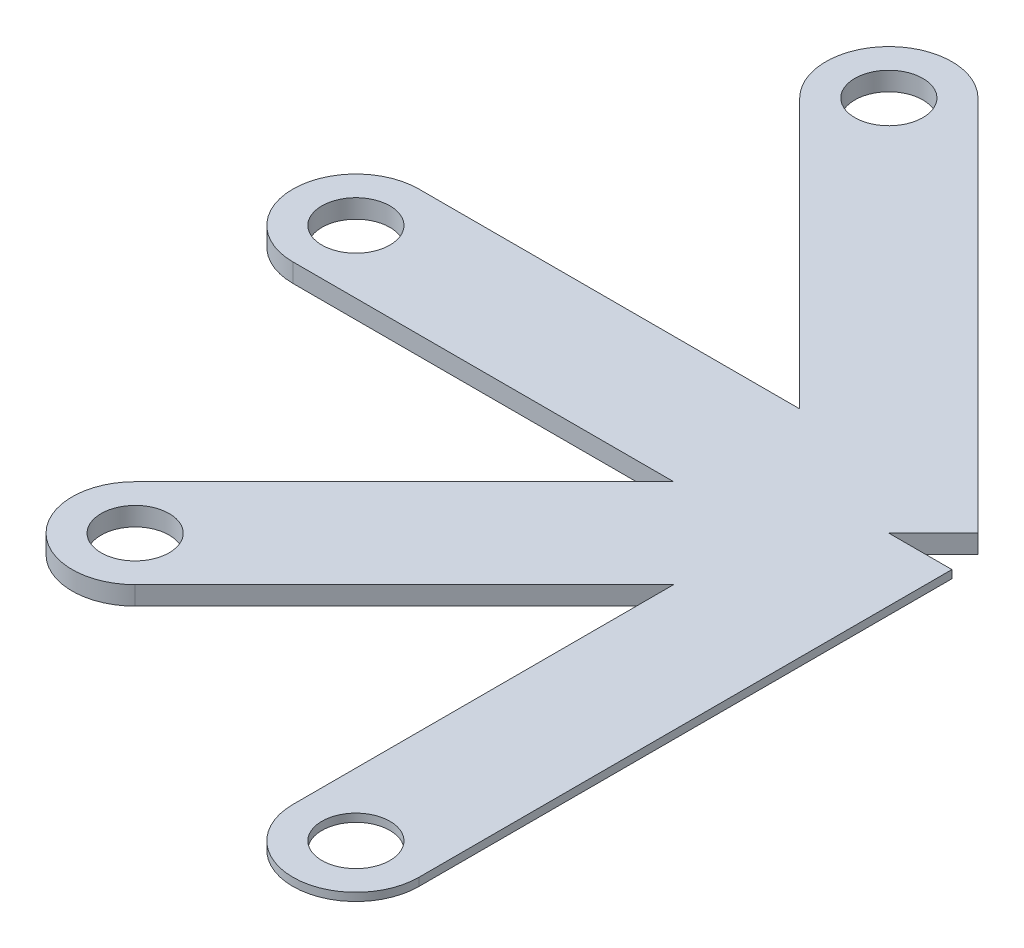
ISO-10303-21;
HEADER;
FILE_DESCRIPTION(('STEP AP214'),'2;1');
FILE_NAME('part.step','',(''),(''),'','','');
FILE_SCHEMA(('AUTOMOTIVE_DESIGN { 1 0 10303 214 1 1 1 1 }'));
ENDSEC;
DATA;
#1=APPLICATION_CONTEXT('core data for automotive mechanical design processes');
#2=APPLICATION_PROTOCOL_DEFINITION('international standard','automotive_design',2000,#1);
#3=PRODUCT_CONTEXT('',#1,'mechanical');
#4=PRODUCT('Part','Part','',(#3));
#5=PRODUCT_RELATED_PRODUCT_CATEGORY('part','',(#4));
#6=PRODUCT_DEFINITION_FORMATION('','',#4);
#7=PRODUCT_DEFINITION_CONTEXT('part definition',#1,'design');
#8=PRODUCT_DEFINITION('design','',#6,#7);
#9=PRODUCT_DEFINITION_SHAPE('','',#8);
#10=(LENGTH_UNIT() NAMED_UNIT(*) SI_UNIT(.MILLI.,.METRE.));
#11=(NAMED_UNIT(*) PLANE_ANGLE_UNIT() SI_UNIT($,.RADIAN.));
#12=(NAMED_UNIT(*) SI_UNIT($,.STERADIAN.) SOLID_ANGLE_UNIT());
#13=UNCERTAINTY_MEASURE_WITH_UNIT(LENGTH_MEASURE(1.E-05),#10,'distance_accuracy_value','');
#14=(GEOMETRIC_REPRESENTATION_CONTEXT(3) GLOBAL_UNCERTAINTY_ASSIGNED_CONTEXT((#13)) GLOBAL_UNIT_ASSIGNED_CONTEXT((#10,
#11,#12)) REPRESENTATION_CONTEXT('',''));
#15=CARTESIAN_POINT('',(0.,0.,0.));
#16=DIRECTION('',(0.,0.,1.));
#17=DIRECTION('',(1.,0.,0.));
#18=AXIS2_PLACEMENT_3D('',#15,#16,#17);
#19=CARTESIAN_POINT('',(1.69726840688207,-0.7112,1.69726840688207));
#20=DIRECTION('',(0.707106781186548,0.,-0.707106781186547));
#21=DIRECTION('',(-0.707106781186547,0.,-0.707106781186548));
#22=AXIS2_PLACEMENT_3D('',#19,#20,#21);
#23=PLANE('',#22);
#24=DIRECTION('',(0.,1.,0.));
#25=VECTOR('',#24,1.);
#26=CARTESIAN_POINT('',(1.69726840688207,-0.7112,1.69726840688207));
#27=LINE('',#26,#25);
#28=CARTESIAN_POINT('',(1.69726840688207,-0.3048,1.69726840688207));
#29=VERTEX_POINT('',#28);
#30=CARTESIAN_POINT('',(1.69726840688207,-0.7112,1.69726840688207));
#31=VERTEX_POINT('',#30);
#32=EDGE_CURVE('E202',#29,#31,#27,.F.);
#33=ORIENTED_EDGE('',*,*,#32,.T.);
#34=DIRECTION('',(-0.707106781186546,0.,-0.707106781186549));
#35=VECTOR('',#34,1.);
#36=CARTESIAN_POINT('',(1.69726840688207,-0.7112,1.69726840688207));
#37=LINE('',#36,#35);
#38=CARTESIAN_POINT('',(0.,-0.7112,0.));
#39=VERTEX_POINT('',#38);
#40=EDGE_CURVE('E177',#31,#39,#37,.T.);
#41=ORIENTED_EDGE('',*,*,#40,.T.);
#42=DIRECTION('',(0.,1.,0.));
#43=VECTOR('',#42,1.);
#44=CARTESIAN_POINT('',(0.,-0.7112,0.));
#45=LINE('',#44,#43);
#46=CARTESIAN_POINT('',(0.,-0.3048,0.));
#47=VERTEX_POINT('',#46);
#48=EDGE_CURVE('E117',#39,#47,#45,.T.);
#49=ORIENTED_EDGE('',*,*,#48,.T.);
#50=DIRECTION('',(0.707106781186547,0.,0.707106781186548));
#51=VECTOR('',#50,1.);
#52=CARTESIAN_POINT('',(0.,-0.3048,0.));
#53=LINE('',#52,#51);
#54=EDGE_CURVE('E192',#47,#29,#53,.T.);
#55=ORIENTED_EDGE('',*,*,#54,.T.);
#56=EDGE_LOOP('',(#33,#41,#49,#55));
#57=FACE_BOUND('',#56,.T.);
#58=ADVANCED_FACE('F16',(#57),#23,.T.);
#59=CARTESIAN_POINT('',(0.,-0.3048,20.2946));
#60=DIRECTION('',(0.,1.,0.));
#61=DIRECTION('',(0.,0.,1.));
#62=AXIS2_PLACEMENT_3D('',#59,#60,#61);
#63=PLANE('',#62);
#64=DIRECTION('',(0.707106781186547,0.,-0.707106781186548));
#65=VECTOR('',#64,1.);
#66=CARTESIAN_POINT('',(-12.6531808745864,-0.3048,16.0477176883506));
#67=LINE('',#66,#65);
#68=CARTESIAN_POINT('',(-2.4003,-0.3048,5.79483681376415));
#69=VERTEX_POINT('',#68);
#70=EDGE_CURVE('E215',#29,#69,#67,.F.);
#71=ORIENTED_EDGE('',*,*,#70,.F.);
#72=ORIENTED_EDGE('',*,*,#54,.F.);
#73=DIRECTION('',(-1.,0.,0.));
#74=VECTOR('',#73,1.);
#75=CARTESIAN_POINT('',(2.4003,-0.3048,0.));
#76=LINE('',#75,#74);
#77=CARTESIAN_POINT('',(2.4003,-0.3048,0.));
#78=VERTEX_POINT('',#77);
#79=EDGE_CURVE('E195',#78,#47,#76,.T.);
#80=ORIENTED_EDGE('',*,*,#79,.F.);
#81=DIRECTION('',(0.,0.,-1.));
#82=VECTOR('',#81,1.);
#83=CARTESIAN_POINT('',(2.4003,-0.3048,20.2946));
#84=LINE('',#83,#82);
#85=CARTESIAN_POINT('',(2.4003,-0.3048,20.2946));
#86=VERTEX_POINT('',#85);
#87=EDGE_CURVE('E125',#86,#78,#84,.T.);
#88=ORIENTED_EDGE('',*,*,#87,.F.);
#89=CARTESIAN_POINT('',(0.,-0.3048,20.2946));
#90=DIRECTION('',(0.,-1.,0.));
#91=DIRECTION('',(0.,0.,-1.));
#92=AXIS2_PLACEMENT_3D('',#89,#90,#91);
#93=CIRCLE('',#92,2.4003);
#94=CARTESIAN_POINT('',(-2.4003,-0.3048,20.2946));
#95=VERTEX_POINT('',#94);
#96=EDGE_CURVE('E281',#95,#86,#93,.F.);
#97=ORIENTED_EDGE('',*,*,#96,.F.);
#98=DIRECTION('',(0.,0.,1.));
#99=VECTOR('',#98,1.);
#100=CARTESIAN_POINT('',(-2.4003,-0.3048,0.));
#101=LINE('',#100,#99);
#102=EDGE_CURVE('E209',#69,#95,#101,.T.);
#103=ORIENTED_EDGE('',*,*,#102,.F.);
#104=EDGE_LOOP('',(#71,#72,#80,#88,#97,#103));
#105=FACE_BOUND('',#104,.T.);
#106=CARTESIAN_POINT('',(0.,-0.3048,20.2946));
#107=DIRECTION('',(0.,-1.,0.));
#108=DIRECTION('',(0.,0.,-1.));
#109=AXIS2_PLACEMENT_3D('',#106,#107,#108);
#110=CIRCLE('',#109,1.2954);
#111=CARTESIAN_POINT('',(0.,-0.3048,18.9992));
#112=VERTEX_POINT('',#111);
#113=EDGE_CURVE('E274',#112,#112,#110,.F.);
#114=ORIENTED_EDGE('',*,*,#113,.T.);
#115=EDGE_LOOP('',(#114));
#116=FACE_BOUND('',#115,.T.);
#117=ADVANCED_FACE('F552',(#105,#116),#63,.F.);
#118=CARTESIAN_POINT('',(-14.3504492814685,-0.7112,14.3504492814685));
#119=DIRECTION('',(0.,1.,0.));
#120=DIRECTION('',(0.,0.,1.));
#121=AXIS2_PLACEMENT_3D('',#118,#119,#120);
#122=PLANE('',#121);
#123=CARTESIAN_POINT('',(-14.3504492814685,-0.7112,-14.3504492814685));
#124=DIRECTION('',(0.,-1.,0.));
#125=DIRECTION('',(0.,0.,-1.));
#126=AXIS2_PLACEMENT_3D('',#123,#124,#125);
#127=CIRCLE('',#126,1.2954);
#128=CARTESIAN_POINT('',(-14.3504492814685,-0.7112,-15.6458492814685));
#129=VERTEX_POINT('',#128);
#130=EDGE_CURVE('E264',#129,#129,#127,.F.);
#131=ORIENTED_EDGE('',*,*,#130,.T.);
#132=EDGE_LOOP('',(#131));
#133=FACE_BOUND('',#132,.T.);
#134=CARTESIAN_POINT('',(-20.2946,-0.7112,0.));
#135=DIRECTION('',(0.,-1.,0.));
#136=DIRECTION('',(0.,0.,-1.));
#137=AXIS2_PLACEMENT_3D('',#134,#135,#136);
#138=CIRCLE('',#137,1.2954);
#139=CARTESIAN_POINT('',(-20.2946,-0.7112,-1.2954));
#140=VERTEX_POINT('',#139);
#141=EDGE_CURVE('E268',#140,#140,#138,.F.);
#142=ORIENTED_EDGE('',*,*,#141,.T.);
#143=EDGE_LOOP('',(#142));
#144=FACE_BOUND('',#143,.T.);
#145=CARTESIAN_POINT('',(-14.3504492814685,-0.7112,14.3504492814685));
#146=DIRECTION('',(0.,-1.,0.));
#147=DIRECTION('',(0.,0.,-1.));
#148=AXIS2_PLACEMENT_3D('',#145,#146,#147);
#149=CIRCLE('',#148,1.2954);
#150=CARTESIAN_POINT('',(-14.3504492814685,-0.7112,13.0550492814685));
#151=VERTEX_POINT('',#150);
#152=EDGE_CURVE('E271',#151,#151,#149,.F.);
#153=ORIENTED_EDGE('',*,*,#152,.T.);
#154=EDGE_LOOP('',(#153));
#155=FACE_BOUND('',#154,.T.);
#156=DIRECTION('',(0.707106781186548,0.,0.707106781186547));
#157=VECTOR('',#156,1.);
#158=CARTESIAN_POINT('',(-16.0477176883506,-0.7112,-12.6531808745864));
#159=LINE('',#158,#157);
#160=CARTESIAN_POINT('',(-16.0477176883506,-0.7112,-12.6531808745864));
#161=VERTEX_POINT('',#160);
#162=CARTESIAN_POINT('',(-5.79483681376415,-0.7112,-2.4003));
#163=VERTEX_POINT('',#162);
#164=EDGE_CURVE('E104',#161,#163,#159,.T.);
#165=ORIENTED_EDGE('',*,*,#164,.F.);
#166=CARTESIAN_POINT('',(-14.3504492814685,-0.7112,-14.3504492814685));
#167=DIRECTION('',(0.,-1.,0.));
#168=DIRECTION('',(0.,0.,-1.));
#169=AXIS2_PLACEMENT_3D('',#166,#167,#168);
#170=CIRCLE('',#169,2.4003);
#171=CARTESIAN_POINT('',(-12.6531808745865,-0.7112,-16.0477176883506));
#172=VERTEX_POINT('',#171);
#173=EDGE_CURVE('E278',#172,#161,#170,.F.);
#174=ORIENTED_EDGE('',*,*,#173,.F.);
#175=DIRECTION('',(-0.707106781186548,0.,-0.707106781186547));
#176=VECTOR('',#175,1.);
#177=CARTESIAN_POINT('',(1.69726840688207,-0.7112,-1.69726840688207));
#178=LINE('',#177,#176);
#179=CARTESIAN_POINT('',(1.69726840688207,-0.7112,-1.69726840688207));
#180=VERTEX_POINT('',#179);
#181=EDGE_CURVE('E180',#180,#172,#178,.T.);
#182=ORIENTED_EDGE('',*,*,#181,.F.);
#183=DIRECTION('',(0.707106781186548,0.,-0.707106781186547));
#184=VECTOR('',#183,1.);
#185=CARTESIAN_POINT('',(-1.69726840688207,-0.7112,1.69726840688207));
#186=LINE('',#185,#184);
#187=EDGE_CURVE('E185',#39,#180,#186,.T.);
#188=ORIENTED_EDGE('',*,*,#187,.F.);
#189=ORIENTED_EDGE('',*,*,#40,.F.);
#190=DIRECTION('',(0.707106781186547,0.,-0.707106781186548));
#191=VECTOR('',#190,1.);
#192=CARTESIAN_POINT('',(-12.6531808745864,-0.7112,16.0477176883506));
#193=LINE('',#192,#191);
#194=CARTESIAN_POINT('',(-12.6531808745864,-0.7112,16.0477176883506));
#195=VERTEX_POINT('',#194);
#196=EDGE_CURVE('E220',#195,#31,#193,.T.);
#197=ORIENTED_EDGE('',*,*,#196,.F.);
#198=CARTESIAN_POINT('',(-14.3504492814685,-0.7112,14.3504492814685));
#199=DIRECTION('',(0.,-1.,0.));
#200=DIRECTION('',(0.,0.,-1.));
#201=AXIS2_PLACEMENT_3D('',#198,#199,#200);
#202=CIRCLE('',#201,2.4003);
#203=CARTESIAN_POINT('',(-16.0477176883506,-0.7112,12.6531808745864));
#204=VERTEX_POINT('',#203);
#205=EDGE_CURVE('E153',#204,#195,#202,.F.);
#206=ORIENTED_EDGE('',*,*,#205,.F.);
#207=DIRECTION('',(-0.707106781186547,0.,0.707106781186548));
#208=VECTOR('',#207,1.);
#209=CARTESIAN_POINT('',(-1.69726840688207,-0.7112,-1.69726840688207));
#210=LINE('',#209,#208);
#211=CARTESIAN_POINT('',(-5.79483681376414,-0.7112,2.40030000000001));
#212=VERTEX_POINT('',#211);
#213=EDGE_CURVE('E150',#212,#204,#210,.T.);
#214=ORIENTED_EDGE('',*,*,#213,.F.);
#215=DIRECTION('',(1.,0.,0.));
#216=VECTOR('',#215,1.);
#217=CARTESIAN_POINT('',(-20.2946,-0.7112,2.4003));
#218=LINE('',#217,#216);
#219=CARTESIAN_POINT('',(-20.2946,-0.7112,2.4003));
#220=VERTEX_POINT('',#219);
#221=EDGE_CURVE('E138',#220,#212,#218,.T.);
#222=ORIENTED_EDGE('',*,*,#221,.F.);
#223=CARTESIAN_POINT('',(-20.2946,-0.7112,0.));
#224=DIRECTION('',(0.,-1.,0.));
#225=DIRECTION('',(0.,0.,-1.));
#226=AXIS2_PLACEMENT_3D('',#223,#224,#225);
#227=CIRCLE('',#226,2.4003);
#228=CARTESIAN_POINT('',(-20.2946,-0.7112,-2.4003));
#229=VERTEX_POINT('',#228);
#230=EDGE_CURVE('E19',#229,#220,#227,.F.);
#231=ORIENTED_EDGE('',*,*,#230,.F.);
#232=DIRECTION('',(-1.,0.,0.));
#233=VECTOR('',#232,1.);
#234=CARTESIAN_POINT('',(0.,-0.7112,-2.4003));
#235=LINE('',#234,#233);
#236=EDGE_CURVE('E96',#163,#229,#235,.T.);
#237=ORIENTED_EDGE('',*,*,#236,.F.);
#238=EDGE_LOOP('',(#165,#174,#182,#188,#189,#197,#206,#214,#222,#231,#237));
#239=FACE_BOUND('',#238,.T.);
#240=ADVANCED_FACE('F151',(#133,#144,#155,#239),#122,.F.);
#241=CARTESIAN_POINT('',(-16.0477176883506,-0.7112,-12.6531808745864));
#242=DIRECTION('',(-0.707106781186547,0.,0.707106781186548));
#243=DIRECTION('',(0.707106781186548,0.,0.707106781186547));
#244=AXIS2_PLACEMENT_3D('',#241,#242,#243);
#245=PLANE('',#244);
#246=DIRECTION('',(0.707106781186548,0.,0.707106781186547));
#247=VECTOR('',#246,1.);
#248=CARTESIAN_POINT('',(-16.0477176883506,0.,-12.6531808745864));
#249=LINE('',#248,#247);
#250=CARTESIAN_POINT('',(-16.0477176883506,0.,-12.6531808745864));
#251=VERTEX_POINT('',#250);
#252=CARTESIAN_POINT('',(-5.79483681376415,0.,-2.4003));
#253=VERTEX_POINT('',#252);
#254=EDGE_CURVE('E267',#251,#253,#249,.T.);
#255=ORIENTED_EDGE('',*,*,#254,.F.);
#256=DIRECTION('',(0.,-1.,0.));
#257=VECTOR('',#256,1.);
#258=CARTESIAN_POINT('',(-16.0477176883506,-0.7112,-12.6531808745864));
#259=LINE('',#258,#257);
#260=EDGE_CURVE('E277',#161,#251,#259,.F.);
#261=ORIENTED_EDGE('',*,*,#260,.F.);
#262=ORIENTED_EDGE('',*,*,#164,.T.);
#263=DIRECTION('',(0.,1.,0.));
#264=VECTOR('',#263,1.);
#265=CARTESIAN_POINT('',(-5.79483681376415,-0.7112,-2.4003));
#266=LINE('',#265,#264);
#267=EDGE_CURVE('E172',#253,#163,#266,.F.);
#268=ORIENTED_EDGE('',*,*,#267,.F.);
#269=EDGE_LOOP('',(#255,#261,#262,#268));
#270=FACE_BOUND('',#269,.T.);
#271=ADVANCED_FACE('F365',(#270),#245,.T.);
#272=CARTESIAN_POINT('',(0.,-0.7112,-2.4003));
#273=DIRECTION('',(0.,0.,-1.));
#274=DIRECTION('',(-1.,0.,0.));
#275=AXIS2_PLACEMENT_3D('',#272,#273,#274);
#276=PLANE('',#275);
#277=DIRECTION('',(0.,-1.,0.));
#278=VECTOR('',#277,1.);
#279=CARTESIAN_POINT('',(-20.2946,-0.7112,-2.4003));
#280=LINE('',#279,#278);
#281=CARTESIAN_POINT('',(-20.2946,0.,-2.4003));
#282=VERTEX_POINT('',#281);
#283=EDGE_CURVE('E169',#282,#229,#280,.T.);
#284=ORIENTED_EDGE('',*,*,#283,.F.);
#285=DIRECTION('',(1.,0.,0.));
#286=VECTOR('',#285,1.);
#287=CARTESIAN_POINT('',(0.,0.,-2.4003));
#288=LINE('',#287,#286);
#289=EDGE_CURVE('E263',#253,#282,#288,.F.);
#290=ORIENTED_EDGE('',*,*,#289,.F.);
#291=ORIENTED_EDGE('',*,*,#267,.T.);
#292=ORIENTED_EDGE('',*,*,#236,.T.);
#293=EDGE_LOOP('',(#284,#290,#291,#292));
#294=FACE_BOUND('',#293,.T.);
#295=ADVANCED_FACE('F368',(#294),#276,.T.);
#296=CARTESIAN_POINT('',(-20.2946,-0.7112,0.));
#297=DIRECTION('',(0.,-1.,0.));
#298=DIRECTION('',(0.,0.,-1.));
#299=AXIS2_PLACEMENT_3D('',#296,#297,#298);
#300=CYLINDRICAL_SURFACE('',#299,2.4003);
#301=ORIENTED_EDGE('',*,*,#230,.T.);
#302=DIRECTION('',(0.,1.,0.));
#303=VECTOR('',#302,1.);
#304=CARTESIAN_POINT('',(-20.2946,-0.7112,2.4003));
#305=LINE('',#304,#303);
#306=CARTESIAN_POINT('',(-20.2946,0.,2.4003));
#307=VERTEX_POINT('',#306);
#308=EDGE_CURVE('E145',#307,#220,#305,.F.);
#309=ORIENTED_EDGE('',*,*,#308,.F.);
#310=CARTESIAN_POINT('',(-20.2946,0.,0.));
#311=DIRECTION('',(0.,-1.,0.));
#312=DIRECTION('',(0.,0.,-1.));
#313=AXIS2_PLACEMENT_3D('',#310,#311,#312);
#314=CIRCLE('',#313,2.4003);
#315=EDGE_CURVE('E259',#282,#307,#314,.F.);
#316=ORIENTED_EDGE('',*,*,#315,.F.);
#317=ORIENTED_EDGE('',*,*,#283,.T.);
#318=EDGE_LOOP('',(#301,#309,#316,#317));
#319=FACE_BOUND('',#318,.T.);
#320=ADVANCED_FACE('F370',(#319),#300,.T.);
#321=CARTESIAN_POINT('',(-20.2946,-0.7112,2.4003));
#322=DIRECTION('',(0.,0.,1.));
#323=DIRECTION('',(1.,0.,0.));
#324=AXIS2_PLACEMENT_3D('',#321,#322,#323);
#325=PLANE('',#324);
#326=DIRECTION('',(1.,0.,0.));
#327=VECTOR('',#326,1.);
#328=CARTESIAN_POINT('',(0.,0.,2.4003));
#329=LINE('',#328,#327);
#330=CARTESIAN_POINT('',(-5.79483681376415,0.,2.4003));
#331=VERTEX_POINT('',#330);
#332=EDGE_CURVE('E262',#307,#331,#329,.T.);
#333=ORIENTED_EDGE('',*,*,#332,.F.);
#334=ORIENTED_EDGE('',*,*,#308,.T.);
#335=ORIENTED_EDGE('',*,*,#221,.T.);
#336=DIRECTION('',(0.,1.,0.));
#337=VECTOR('',#336,1.);
#338=CARTESIAN_POINT('',(-5.79483681376414,-0.7112,2.40030000000001));
#339=LINE('',#338,#337);
#340=EDGE_CURVE('E143',#331,#212,#339,.F.);
#341=ORIENTED_EDGE('',*,*,#340,.F.);
#342=EDGE_LOOP('',(#333,#334,#335,#341));
#343=FACE_BOUND('',#342,.T.);
#344=ADVANCED_FACE('F141',(#343),#325,.T.);
#345=CARTESIAN_POINT('',(-1.69726840688207,-0.7112,-1.69726840688207));
#346=DIRECTION('',(-0.707106781186548,0.,-0.707106781186547));
#347=DIRECTION('',(-0.707106781186547,0.,0.707106781186548));
#348=AXIS2_PLACEMENT_3D('',#345,#346,#347);
#349=PLANE('',#348);
#350=DIRECTION('',(0.,-1.,0.));
#351=VECTOR('',#350,1.);
#352=CARTESIAN_POINT('',(-16.0477176883506,-0.7112,12.6531808745864));
#353=LINE('',#352,#351);
#354=CARTESIAN_POINT('',(-16.0477176883506,0.,12.6531808745864));
#355=VERTEX_POINT('',#354);
#356=EDGE_CURVE('E156',#355,#204,#353,.T.);
#357=ORIENTED_EDGE('',*,*,#356,.F.);
#358=DIRECTION('',(-0.707106781186547,0.,0.707106781186548));
#359=VECTOR('',#358,1.);
#360=CARTESIAN_POINT('',(-5.79483681376415,0.,2.4003));
#361=LINE('',#360,#359);
#362=EDGE_CURVE('E160',#331,#355,#361,.T.);
#363=ORIENTED_EDGE('',*,*,#362,.F.);
#364=ORIENTED_EDGE('',*,*,#340,.T.);
#365=ORIENTED_EDGE('',*,*,#213,.T.);
#366=EDGE_LOOP('',(#357,#363,#364,#365));
#367=FACE_BOUND('',#366,.T.);
#368=ADVANCED_FACE('F158',(#367),#349,.T.);
#369=CARTESIAN_POINT('',(-14.3504492814685,-0.7112,14.3504492814685));
#370=DIRECTION('',(0.,-1.,0.));
#371=DIRECTION('',(0.,0.,-1.));
#372=AXIS2_PLACEMENT_3D('',#369,#370,#371);
#373=CYLINDRICAL_SURFACE('',#372,2.4003);
#374=ORIENTED_EDGE('',*,*,#205,.T.);
#375=DIRECTION('',(0.,1.,0.));
#376=VECTOR('',#375,1.);
#377=CARTESIAN_POINT('',(-12.6531808745864,-0.7112,16.0477176883506));
#378=LINE('',#377,#376);
#379=CARTESIAN_POINT('',(-12.6531808745864,0.,16.0477176883506));
#380=VERTEX_POINT('',#379);
#381=EDGE_CURVE('E217',#380,#195,#378,.F.);
#382=ORIENTED_EDGE('',*,*,#381,.F.);
#383=CARTESIAN_POINT('',(-14.3504492814685,0.,14.3504492814685));
#384=DIRECTION('',(0.,-1.,0.));
#385=DIRECTION('',(0.,0.,-1.));
#386=AXIS2_PLACEMENT_3D('',#383,#384,#385);
#387=CIRCLE('',#386,2.4003);
#388=EDGE_CURVE('E255',#355,#380,#387,.F.);
#389=ORIENTED_EDGE('',*,*,#388,.F.);
#390=ORIENTED_EDGE('',*,*,#356,.T.);
#391=EDGE_LOOP('',(#374,#382,#389,#390));
#392=FACE_BOUND('',#391,.T.);
#393=ADVANCED_FACE('F284',(#392),#373,.T.);
#394=CARTESIAN_POINT('',(-12.6531808745864,-0.7112,16.0477176883506));
#395=DIRECTION('',(0.707106781186548,0.,0.707106781186547));
#396=DIRECTION('',(0.707106781186547,0.,-0.707106781186548));
#397=AXIS2_PLACEMENT_3D('',#394,#395,#396);
#398=PLANE('',#397);
#399=ORIENTED_EDGE('',*,*,#196,.T.);
#400=ORIENTED_EDGE('',*,*,#32,.F.);
#401=ORIENTED_EDGE('',*,*,#70,.T.);
#402=DIRECTION('',(0.,1.,0.));
#403=VECTOR('',#402,1.);
#404=CARTESIAN_POINT('',(-2.4003,-0.3048,5.79483681376415));
#405=LINE('',#404,#403);
#406=CARTESIAN_POINT('',(-2.4003,0.,5.79483681376415));
#407=VERTEX_POINT('',#406);
#408=EDGE_CURVE('E212',#407,#69,#405,.F.);
#409=ORIENTED_EDGE('',*,*,#408,.F.);
#410=DIRECTION('',(0.707106781186548,0.,-0.707106781186548));
#411=VECTOR('',#410,1.);
#412=CARTESIAN_POINT('',(-12.6531808745864,0.,16.0477176883506));
#413=LINE('',#412,#411);
#414=EDGE_CURVE('E258',#380,#407,#413,.T.);
#415=ORIENTED_EDGE('',*,*,#414,.F.);
#416=ORIENTED_EDGE('',*,*,#381,.T.);
#417=EDGE_LOOP('',(#399,#400,#401,#409,#415,#416));
#418=FACE_BOUND('',#417,.T.);
#419=ADVANCED_FACE('F341',(#418),#398,.T.);
#420=CARTESIAN_POINT('',(-2.4003,-0.3048,0.));
#421=DIRECTION('',(-1.,0.,0.));
#422=DIRECTION('',(0.,0.,1.));
#423=AXIS2_PLACEMENT_3D('',#420,#421,#422);
#424=PLANE('',#423);
#425=DIRECTION('',(0.,-1.,0.));
#426=VECTOR('',#425,1.);
#427=CARTESIAN_POINT('',(-2.4003,-0.3048,20.2946));
#428=LINE('',#427,#426);
#429=CARTESIAN_POINT('',(-2.4003,0.,20.2946));
#430=VERTEX_POINT('',#429);
#431=EDGE_CURVE('E211',#430,#95,#428,.T.);
#432=ORIENTED_EDGE('',*,*,#431,.F.);
#433=DIRECTION('',(0.,0.,1.));
#434=VECTOR('',#433,1.);
#435=CARTESIAN_POINT('',(-2.4003,0.,20.2946));
#436=LINE('',#435,#434);
#437=EDGE_CURVE('E254',#407,#430,#436,.T.);
#438=ORIENTED_EDGE('',*,*,#437,.F.);
#439=ORIENTED_EDGE('',*,*,#408,.T.);
#440=ORIENTED_EDGE('',*,*,#102,.T.);
#441=EDGE_LOOP('',(#432,#438,#439,#440));
#442=FACE_BOUND('',#441,.T.);
#443=ADVANCED_FACE('F419',(#442),#424,.T.);
#444=CARTESIAN_POINT('',(0.,-0.3048,20.2946));
#445=DIRECTION('',(0.,-1.,0.));
#446=DIRECTION('',(0.,0.,-1.));
#447=AXIS2_PLACEMENT_3D('',#444,#445,#446);
#448=CYLINDRICAL_SURFACE('',#447,2.4003);
#449=ORIENTED_EDGE('',*,*,#96,.T.);
#450=DIRECTION('',(0.,1.,0.));
#451=VECTOR('',#450,1.);
#452=CARTESIAN_POINT('',(2.4003,-0.3048,20.2946));
#453=LINE('',#452,#451);
#454=CARTESIAN_POINT('',(2.4003,0.,20.2946));
#455=VERTEX_POINT('',#454);
#456=EDGE_CURVE('E206',#455,#86,#453,.F.);
#457=ORIENTED_EDGE('',*,*,#456,.F.);
#458=CARTESIAN_POINT('',(0.,0.,20.2946));
#459=DIRECTION('',(0.,-1.,0.));
#460=DIRECTION('',(0.,0.,-1.));
#461=AXIS2_PLACEMENT_3D('',#458,#459,#460);
#462=CIRCLE('',#461,2.4003);
#463=EDGE_CURVE('E250',#430,#455,#462,.F.);
#464=ORIENTED_EDGE('',*,*,#463,.F.);
#465=ORIENTED_EDGE('',*,*,#431,.T.);
#466=EDGE_LOOP('',(#449,#457,#464,#465));
#467=FACE_BOUND('',#466,.T.);
#468=ADVANCED_FACE('F416',(#467),#448,.T.);
#469=CARTESIAN_POINT('',(2.4003,-0.3048,20.2946));
#470=DIRECTION('',(1.,0.,0.));
#471=DIRECTION('',(0.,0.,-1.));
#472=AXIS2_PLACEMENT_3D('',#469,#470,#471);
#473=PLANE('',#472);
#474=ORIENTED_EDGE('',*,*,#87,.T.);
#475=DIRECTION('',(0.,1.,0.));
#476=VECTOR('',#475,1.);
#477=CARTESIAN_POINT('',(2.4003,-0.3048,0.));
#478=LINE('',#477,#476);
#479=CARTESIAN_POINT('',(2.4003,0.,0.));
#480=VERTEX_POINT('',#479);
#481=EDGE_CURVE('E198',#480,#78,#478,.F.);
#482=ORIENTED_EDGE('',*,*,#481,.F.);
#483=DIRECTION('',(0.,0.,1.));
#484=VECTOR('',#483,1.);
#485=CARTESIAN_POINT('',(2.4003,0.,20.2946));
#486=LINE('',#485,#484);
#487=EDGE_CURVE('E253',#455,#480,#486,.F.);
#488=ORIENTED_EDGE('',*,*,#487,.F.);
#489=ORIENTED_EDGE('',*,*,#456,.T.);
#490=EDGE_LOOP('',(#474,#482,#488,#489));
#491=FACE_BOUND('',#490,.T.);
#492=ADVANCED_FACE('F412',(#491),#473,.T.);
#493=CARTESIAN_POINT('',(2.4003,-0.3048,0.));
#494=DIRECTION('',(0.,0.,-1.));
#495=DIRECTION('',(-1.,0.,0.));
#496=AXIS2_PLACEMENT_3D('',#493,#494,#495);
#497=PLANE('',#496);
#498=ORIENTED_EDGE('',*,*,#481,.T.);
#499=ORIENTED_EDGE('',*,*,#79,.T.);
#500=DIRECTION('',(0.,1.,0.));
#501=VECTOR('',#500,1.);
#502=CARTESIAN_POINT('',(0.,-0.7112,0.));
#503=LINE('',#502,#501);
#504=CARTESIAN_POINT('',(0.,0.,0.));
#505=VERTEX_POINT('',#504);
#506=EDGE_CURVE('E188',#505,#47,#503,.F.);
#507=ORIENTED_EDGE('',*,*,#506,.F.);
#508=DIRECTION('',(1.,0.,0.));
#509=VECTOR('',#508,1.);
#510=CARTESIAN_POINT('',(0.,0.,0.));
#511=LINE('',#510,#509);
#512=EDGE_CURVE('E319',#480,#505,#511,.F.);
#513=ORIENTED_EDGE('',*,*,#512,.F.);
#514=EDGE_LOOP('',(#498,#499,#507,#513));
#515=FACE_BOUND('',#514,.T.);
#516=ADVANCED_FACE('F409',(#515),#497,.T.);
#517=CARTESIAN_POINT('',(-1.69726840688207,-0.7112,1.69726840688207));
#518=DIRECTION('',(0.707106781186547,0.,0.707106781186548));
#519=DIRECTION('',(0.707106781186548,0.,-0.707106781186547));
#520=AXIS2_PLACEMENT_3D('',#517,#518,#519);
#521=PLANE('',#520);
#522=ORIENTED_EDGE('',*,*,#187,.T.);
#523=DIRECTION('',(0.,1.,0.));
#524=VECTOR('',#523,1.);
#525=CARTESIAN_POINT('',(1.69726840688207,-0.7112,-1.69726840688207));
#526=LINE('',#525,#524);
#527=CARTESIAN_POINT('',(1.69726840688207,0.,-1.69726840688207));
#528=VERTEX_POINT('',#527);
#529=EDGE_CURVE('E182',#528,#180,#526,.F.);
#530=ORIENTED_EDGE('',*,*,#529,.F.);
#531=DIRECTION('',(0.707106781186548,0.,-0.707106781186547));
#532=VECTOR('',#531,1.);
#533=CARTESIAN_POINT('',(0.,0.,0.));
#534=LINE('',#533,#532);
#535=EDGE_CURVE('E316',#505,#528,#534,.T.);
#536=ORIENTED_EDGE('',*,*,#535,.F.);
#537=ORIENTED_EDGE('',*,*,#506,.T.);
#538=ORIENTED_EDGE('',*,*,#48,.F.);
#539=EDGE_LOOP('',(#522,#530,#536,#537,#538));
#540=FACE_BOUND('',#539,.T.);
#541=ADVANCED_FACE('F360',(#540),#521,.T.);
#542=CARTESIAN_POINT('',(1.69726840688207,-0.7112,-1.69726840688207));
#543=DIRECTION('',(0.707106781186547,0.,-0.707106781186548));
#544=DIRECTION('',(-0.707106781186548,0.,-0.707106781186547));
#545=AXIS2_PLACEMENT_3D('',#542,#543,#544);
#546=PLANE('',#545);
#547=ORIENTED_EDGE('',*,*,#181,.T.);
#548=DIRECTION('',(0.,-1.,0.));
#549=VECTOR('',#548,1.);
#550=CARTESIAN_POINT('',(-12.6531808745865,-0.7112,-16.0477176883506));
#551=LINE('',#550,#549);
#552=CARTESIAN_POINT('',(-12.6531808745864,0.,-16.0477176883506));
#553=VERTEX_POINT('',#552);
#554=EDGE_CURVE('E34',#553,#172,#551,.T.);
#555=ORIENTED_EDGE('',*,*,#554,.F.);
#556=DIRECTION('',(-0.707106781186548,0.,-0.707106781186547));
#557=VECTOR('',#556,1.);
#558=CARTESIAN_POINT('',(1.69726840688207,0.,-1.69726840688207));
#559=LINE('',#558,#557);
#560=EDGE_CURVE('E249',#528,#553,#559,.T.);
#561=ORIENTED_EDGE('',*,*,#560,.F.);
#562=ORIENTED_EDGE('',*,*,#529,.T.);
#563=EDGE_LOOP('',(#547,#555,#561,#562));
#564=FACE_BOUND('',#563,.T.);
#565=ADVANCED_FACE('F355',(#564),#546,.T.);
#566=CARTESIAN_POINT('',(-14.3504492814685,-0.7112,-14.3504492814685));
#567=DIRECTION('',(0.,-1.,0.));
#568=DIRECTION('',(0.,0.,-1.));
#569=AXIS2_PLACEMENT_3D('',#566,#567,#568);
#570=CYLINDRICAL_SURFACE('',#569,2.4003);
#571=ORIENTED_EDGE('',*,*,#173,.T.);
#572=ORIENTED_EDGE('',*,*,#260,.T.);
#573=CARTESIAN_POINT('',(-14.3504492814685,0.,-14.3504492814685));
#574=DIRECTION('',(0.,-1.,0.));
#575=DIRECTION('',(0.,0.,-1.));
#576=AXIS2_PLACEMENT_3D('',#573,#574,#575);
#577=CIRCLE('',#576,2.4003);
#578=EDGE_CURVE('E246',#553,#251,#577,.F.);
#579=ORIENTED_EDGE('',*,*,#578,.F.);
#580=ORIENTED_EDGE('',*,*,#554,.T.);
#581=EDGE_LOOP('',(#571,#572,#579,#580));
#582=FACE_BOUND('',#581,.T.);
#583=ADVANCED_FACE('F364',(#582),#570,.T.);
#584=CARTESIAN_POINT('',(0.,-0.3048,20.2946));
#585=DIRECTION('',(0.,-1.,0.));
#586=DIRECTION('',(0.,0.,-1.));
#587=AXIS2_PLACEMENT_3D('',#584,#585,#586);
#588=CYLINDRICAL_SURFACE('',#587,1.2954);
#589=CARTESIAN_POINT('',(0.,0.,20.2946));
#590=DIRECTION('',(0.,-1.,0.));
#591=DIRECTION('',(0.,0.,-1.));
#592=AXIS2_PLACEMENT_3D('',#589,#590,#591);
#593=CIRCLE('',#592,1.2954);
#594=CARTESIAN_POINT('',(0.,0.,18.9992));
#595=VERTEX_POINT('',#594);
#596=EDGE_CURVE('E243',#595,#595,#593,.T.);
#597=ORIENTED_EDGE('',*,*,#596,.F.);
#598=EDGE_LOOP('',(#597));
#599=FACE_BOUND('',#598,.T.);
#600=ORIENTED_EDGE('',*,*,#113,.F.);
#601=EDGE_LOOP('',(#600));
#602=FACE_BOUND('',#601,.T.);
#603=ADVANCED_FACE('F398',(#599,#602),#588,.F.);
#604=CARTESIAN_POINT('',(-14.3504492814685,-0.7112,14.3504492814685));
#605=DIRECTION('',(0.,-1.,0.));
#606=DIRECTION('',(0.,0.,-1.));
#607=AXIS2_PLACEMENT_3D('',#604,#605,#606);
#608=CYLINDRICAL_SURFACE('',#607,1.2954);
#609=CARTESIAN_POINT('',(-14.3504492814685,0.,14.3504492814685));
#610=DIRECTION('',(0.,-1.,0.));
#611=DIRECTION('',(0.,0.,-1.));
#612=AXIS2_PLACEMENT_3D('',#609,#610,#611);
#613=CIRCLE('',#612,1.2954);
#614=CARTESIAN_POINT('',(-14.3504492814685,0.,13.0550492814685));
#615=VERTEX_POINT('',#614);
#616=EDGE_CURVE('E240',#615,#615,#613,.T.);
#617=ORIENTED_EDGE('',*,*,#616,.F.);
#618=EDGE_LOOP('',(#617));
#619=FACE_BOUND('',#618,.T.);
#620=ORIENTED_EDGE('',*,*,#152,.F.);
#621=EDGE_LOOP('',(#620));
#622=FACE_BOUND('',#621,.T.);
#623=ADVANCED_FACE('F394',(#619,#622),#608,.F.);
#624=CARTESIAN_POINT('',(-20.2946,-0.7112,0.));
#625=DIRECTION('',(0.,-1.,0.));
#626=DIRECTION('',(0.,0.,-1.));
#627=AXIS2_PLACEMENT_3D('',#624,#625,#626);
#628=CYLINDRICAL_SURFACE('',#627,1.2954);
#629=CARTESIAN_POINT('',(-20.2946,0.,0.));
#630=DIRECTION('',(0.,-1.,0.));
#631=DIRECTION('',(0.,0.,-1.));
#632=AXIS2_PLACEMENT_3D('',#629,#630,#631);
#633=CIRCLE('',#632,1.2954);
#634=CARTESIAN_POINT('',(-20.2946,0.,-1.2954));
#635=VERTEX_POINT('',#634);
#636=EDGE_CURVE('E25',#635,#635,#633,.T.);
#637=ORIENTED_EDGE('',*,*,#636,.F.);
#638=EDGE_LOOP('',(#637));
#639=FACE_BOUND('',#638,.T.);
#640=ORIENTED_EDGE('',*,*,#141,.F.);
#641=EDGE_LOOP('',(#640));
#642=FACE_BOUND('',#641,.T.);
#643=ADVANCED_FACE('F387',(#639,#642),#628,.F.);
#644=CARTESIAN_POINT('',(-14.3504492814685,-0.7112,-14.3504492814685));
#645=DIRECTION('',(0.,-1.,0.));
#646=DIRECTION('',(0.,0.,-1.));
#647=AXIS2_PLACEMENT_3D('',#644,#645,#646);
#648=CYLINDRICAL_SURFACE('',#647,1.2954);
#649=CARTESIAN_POINT('',(-14.3504492814685,0.,-14.3504492814685));
#650=DIRECTION('',(0.,-1.,0.));
#651=DIRECTION('',(0.,0.,-1.));
#652=AXIS2_PLACEMENT_3D('',#649,#650,#651);
#653=CIRCLE('',#652,1.2954);
#654=CARTESIAN_POINT('',(-14.3504492814685,0.,-15.6458492814685));
#655=VERTEX_POINT('',#654);
#656=EDGE_CURVE('E11',#655,#655,#653,.T.);
#657=ORIENTED_EDGE('',*,*,#656,.F.);
#658=EDGE_LOOP('',(#657));
#659=FACE_BOUND('',#658,.T.);
#660=ORIENTED_EDGE('',*,*,#130,.F.);
#661=EDGE_LOOP('',(#660));
#662=FACE_BOUND('',#661,.T.);
#663=ADVANCED_FACE('F381',(#659,#662),#648,.F.);
#664=CARTESIAN_POINT('',(0.,0.,20.2946));
#665=DIRECTION('',(0.,1.,0.));
#666=DIRECTION('',(0.,0.,1.));
#667=AXIS2_PLACEMENT_3D('',#664,#665,#666);
#668=PLANE('',#667);
#669=ORIENTED_EDGE('',*,*,#656,.T.);
#670=EDGE_LOOP('',(#669));
#671=FACE_BOUND('',#670,.T.);
#672=ORIENTED_EDGE('',*,*,#636,.T.);
#673=EDGE_LOOP('',(#672));
#674=FACE_BOUND('',#673,.T.);
#675=ORIENTED_EDGE('',*,*,#616,.T.);
#676=EDGE_LOOP('',(#675));
#677=FACE_BOUND('',#676,.T.);
#678=ORIENTED_EDGE('',*,*,#596,.T.);
#679=EDGE_LOOP('',(#678));
#680=FACE_BOUND('',#679,.T.);
#681=ORIENTED_EDGE('',*,*,#560,.T.);
#682=ORIENTED_EDGE('',*,*,#578,.T.);
#683=ORIENTED_EDGE('',*,*,#254,.T.);
#684=ORIENTED_EDGE('',*,*,#289,.T.);
#685=ORIENTED_EDGE('',*,*,#315,.T.);
#686=ORIENTED_EDGE('',*,*,#332,.T.);
#687=ORIENTED_EDGE('',*,*,#362,.T.);
#688=ORIENTED_EDGE('',*,*,#388,.T.);
#689=ORIENTED_EDGE('',*,*,#414,.T.);
#690=ORIENTED_EDGE('',*,*,#437,.T.);
#691=ORIENTED_EDGE('',*,*,#463,.T.);
#692=ORIENTED_EDGE('',*,*,#487,.T.);
#693=ORIENTED_EDGE('',*,*,#512,.T.);
#694=ORIENTED_EDGE('',*,*,#535,.T.);
#695=EDGE_LOOP('',(#681,#682,#683,#684,#685,#686,#687,#688,#689,#690,#691,#692,#693,#694));
#696=FACE_BOUND('',#695,.T.);
#697=ADVANCED_FACE('F290',(#671,#674,#677,#680,#696),#668,.T.);
#698=CLOSED_SHELL('',(#58,#117,#240,#271,#295,#320,#344,#368,#393,#419,#443,#468,#492,#516,#541,
#565,#583,#603,#623,#643,#663,#697));
#699=MANIFOLD_SOLID_BREP('B1',#698);
#700=ADVANCED_BREP_SHAPE_REPRESENTATION('',(#18,#699),#14);
#701=SHAPE_DEFINITION_REPRESENTATION(#9,#700);
ENDSEC;
END-ISO-10303-21;
